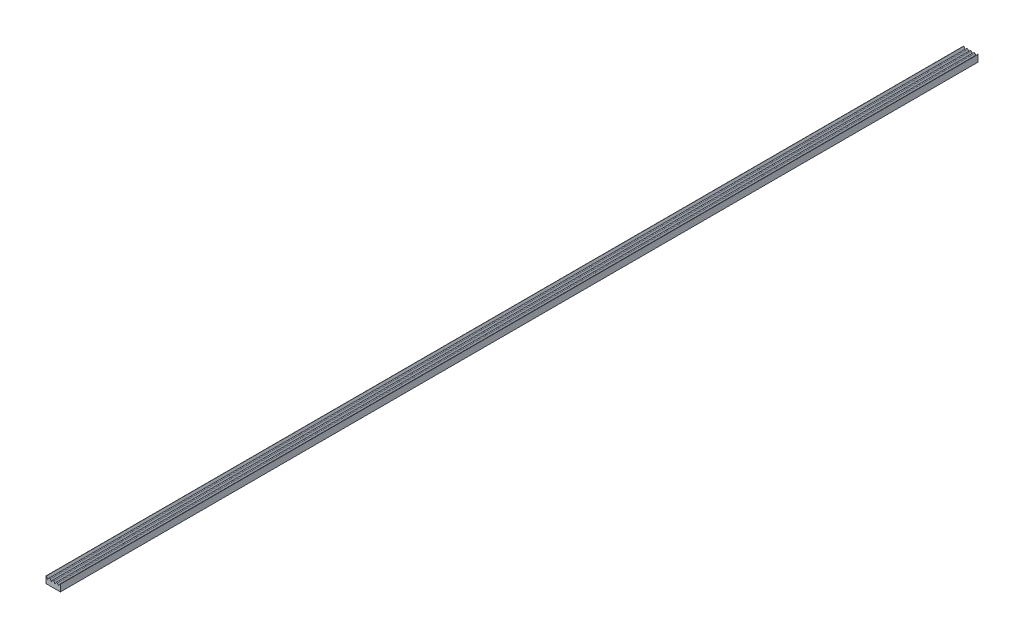
ISO-10303-21;
HEADER;
FILE_DESCRIPTION(('STEP AP214'),'2;1');
FILE_NAME('part.step','',(''),(''),'','','');
FILE_SCHEMA(('AUTOMOTIVE_DESIGN { 1 0 10303 214 1 1 1 1 }'));
ENDSEC;
DATA;
#1=APPLICATION_CONTEXT('core data for automotive mechanical design processes');
#2=APPLICATION_PROTOCOL_DEFINITION('international standard','automotive_design',2000,#1);
#3=PRODUCT_CONTEXT('',#1,'mechanical');
#4=PRODUCT('Part','Part','',(#3));
#5=PRODUCT_RELATED_PRODUCT_CATEGORY('part','',(#4));
#6=PRODUCT_DEFINITION_FORMATION('','',#4);
#7=PRODUCT_DEFINITION_CONTEXT('part definition',#1,'design');
#8=PRODUCT_DEFINITION('design','',#6,#7);
#9=PRODUCT_DEFINITION_SHAPE('','',#8);
#10=(LENGTH_UNIT() NAMED_UNIT(*) SI_UNIT(.MILLI.,.METRE.));
#11=(NAMED_UNIT(*) PLANE_ANGLE_UNIT() SI_UNIT($,.RADIAN.));
#12=(NAMED_UNIT(*) SI_UNIT($,.STERADIAN.) SOLID_ANGLE_UNIT());
#13=UNCERTAINTY_MEASURE_WITH_UNIT(LENGTH_MEASURE(1.E-05),#10,'distance_accuracy_value','');
#14=(GEOMETRIC_REPRESENTATION_CONTEXT(3) GLOBAL_UNCERTAINTY_ASSIGNED_CONTEXT((#13)) GLOBAL_UNIT_ASSIGNED_CONTEXT((#10,
#11,#12)) REPRESENTATION_CONTEXT('',''));
#15=CARTESIAN_POINT('',(0.,0.,0.));
#16=DIRECTION('',(0.,0.,1.));
#17=DIRECTION('',(1.,0.,0.));
#18=AXIS2_PLACEMENT_3D('',#15,#16,#17);
#19=CARTESIAN_POINT('',(0.,0.,809.625));
#20=DIRECTION('',(-1.,0.,0.));
#21=DIRECTION('',(0.,0.,1.));
#22=AXIS2_PLACEMENT_3D('',#19,#20,#21);
#23=PLANE('',#22);
#24=DIRECTION('',(0.,1.,0.));
#25=VECTOR('',#24,1.);
#26=CARTESIAN_POINT('',(0.,0.,0.));
#27=LINE('',#26,#25);
#28=CARTESIAN_POINT('',(0.,0.,0.));
#29=VERTEX_POINT('',#28);
#30=CARTESIAN_POINT('',(0.,5.90717687924576,0.));
#31=VERTEX_POINT('',#30);
#32=EDGE_CURVE('E177',#29,#31,#27,.T.);
#33=ORIENTED_EDGE('',*,*,#32,.T.);
#34=DIRECTION('',(0.,0.,-1.));
#35=VECTOR('',#34,1.);
#36=CARTESIAN_POINT('',(0.,5.90717687924576,809.625));
#37=LINE('',#36,#35);
#38=CARTESIAN_POINT('',(0.,5.90717687924576,809.625));
#39=VERTEX_POINT('',#38);
#40=EDGE_CURVE('E11',#39,#31,#37,.T.);
#41=ORIENTED_EDGE('',*,*,#40,.F.);
#42=DIRECTION('',(0.,1.,0.));
#43=VECTOR('',#42,1.);
#44=CARTESIAN_POINT('',(0.,0.,809.625));
#45=LINE('',#44,#43);
#46=CARTESIAN_POINT('',(0.,0.,809.625));
#47=VERTEX_POINT('',#46);
#48=EDGE_CURVE('E207',#47,#39,#45,.T.);
#49=ORIENTED_EDGE('',*,*,#48,.F.);
#50=DIRECTION('',(0.,0.,-1.));
#51=VECTOR('',#50,1.);
#52=CARTESIAN_POINT('',(0.,0.,809.625));
#53=LINE('',#52,#51);
#54=EDGE_CURVE('E173',#47,#29,#53,.T.);
#55=ORIENTED_EDGE('',*,*,#54,.T.);
#56=EDGE_LOOP('',(#33,#41,#49,#55));
#57=FACE_BOUND('',#56,.T.);
#58=ADVANCED_FACE('F33',(#57),#23,.F.);
#59=CARTESIAN_POINT('',(-0.127,5.90717687924576,809.625));
#60=DIRECTION('',(0.,0.,-1.));
#61=DIRECTION('',(-1.,0.,0.));
#62=AXIS2_PLACEMENT_3D('',#59,#60,#61);
#63=CYLINDRICAL_SURFACE('',#62,0.127);
#64=CARTESIAN_POINT('',(-0.127,5.90717687924576,0.));
#65=DIRECTION('',(0.,0.,1.));
#66=DIRECTION('',(1.,0.,0.));
#67=AXIS2_PLACEMENT_3D('',#64,#65,#66);
#68=CIRCLE('',#67,0.127);
#69=CARTESIAN_POINT('',(-0.234695784608649,5.97448674462616,0.));
#70=VERTEX_POINT('',#69);
#71=EDGE_CURVE('E180',#31,#70,#68,.T.);
#72=ORIENTED_EDGE('',*,*,#71,.T.);
#73=DIRECTION('',(0.,0.,-1.));
#74=VECTOR('',#73,1.);
#75=CARTESIAN_POINT('',(-0.234695784608649,5.97448674462616,809.625));
#76=LINE('',#75,#74);
#77=CARTESIAN_POINT('',(-0.234695784608649,5.97448674462616,809.625));
#78=VERTEX_POINT('',#77);
#79=EDGE_CURVE('E41',#78,#70,#76,.T.);
#80=ORIENTED_EDGE('',*,*,#79,.F.);
#81=CARTESIAN_POINT('',(-0.127,5.90717687924576,809.625));
#82=DIRECTION('',(0.,0.,1.));
#83=DIRECTION('',(1.,0.,0.));
#84=AXIS2_PLACEMENT_3D('',#81,#82,#83);
#85=CIRCLE('',#84,0.127);
#86=EDGE_CURVE('E116',#39,#78,#85,.T.);
#87=ORIENTED_EDGE('',*,*,#86,.F.);
#88=ORIENTED_EDGE('',*,*,#40,.T.);
#89=EDGE_LOOP('',(#72,#80,#87,#88));
#90=FACE_BOUND('',#89,.T.);
#91=ADVANCED_FACE('F305',(#90),#63,.T.);
#92=CARTESIAN_POINT('',(-1.5875,3.81,809.625));
#93=DIRECTION('',(0.847998304005088,-0.529998940003179,0.));
#94=DIRECTION('',(0.529998940003179,0.847998304005088,0.));
#95=AXIS2_PLACEMENT_3D('',#92,#93,#94);
#96=PLANE('',#95);
#97=DIRECTION('',(-0.529998940003179,-0.847998304005088,0.));
#98=VECTOR('',#97,1.);
#99=CARTESIAN_POINT('',(-1.5875,3.81,0.));
#100=LINE('',#99,#98);
#101=CARTESIAN_POINT('',(-1.5875,3.81,0.));
#102=VERTEX_POINT('',#101);
#103=EDGE_CURVE('E182',#70,#102,#100,.T.);
#104=ORIENTED_EDGE('',*,*,#103,.T.);
#105=DIRECTION('',(0.,0.,-1.));
#106=VECTOR('',#105,1.);
#107=CARTESIAN_POINT('',(-1.5875,3.81,809.625));
#108=LINE('',#107,#106);
#109=CARTESIAN_POINT('',(-1.5875,3.81,809.625));
#110=VERTEX_POINT('',#109);
#111=EDGE_CURVE('E238',#110,#102,#108,.T.);
#112=ORIENTED_EDGE('',*,*,#111,.F.);
#113=DIRECTION('',(-0.529998940003179,-0.847998304005088,0.));
#114=VECTOR('',#113,1.);
#115=CARTESIAN_POINT('',(-1.5875,3.81,809.625));
#116=LINE('',#115,#114);
#117=EDGE_CURVE('E246',#78,#110,#116,.T.);
#118=ORIENTED_EDGE('',*,*,#117,.F.);
#119=ORIENTED_EDGE('',*,*,#79,.T.);
#120=EDGE_LOOP('',(#104,#112,#118,#119));
#121=FACE_BOUND('',#120,.T.);
#122=ADVANCED_FACE('F244',(#121),#96,.F.);
#123=CARTESIAN_POINT('',(-2.63652107695677,5.48843372313082,809.625));
#124=DIRECTION('',(-0.847998304005088,-0.52999894000318,0.));
#125=DIRECTION('',(0.52999894000318,-0.847998304005088,0.));
#126=AXIS2_PLACEMENT_3D('',#123,#124,#125);
#127=PLANE('',#126);
#128=DIRECTION('',(-0.52999894000318,0.847998304005088,0.));
#129=VECTOR('',#128,1.);
#130=CARTESIAN_POINT('',(-2.63652107695677,5.48843372313082,0.));
#131=LINE('',#130,#129);
#132=CARTESIAN_POINT('',(-2.63652107695677,5.48843372313082,0.));
#133=VERTEX_POINT('',#132);
#134=EDGE_CURVE('E184',#102,#133,#131,.T.);
#135=ORIENTED_EDGE('',*,*,#134,.T.);
#136=DIRECTION('',(0.,0.,-1.));
#137=VECTOR('',#136,1.);
#138=CARTESIAN_POINT('',(-2.63652107695677,5.48843372313082,809.625));
#139=LINE('',#138,#137);
#140=CARTESIAN_POINT('',(-2.63652107695677,5.48843372313082,809.625));
#141=VERTEX_POINT('',#140);
#142=EDGE_CURVE('E235',#141,#133,#139,.T.);
#143=ORIENTED_EDGE('',*,*,#142,.F.);
#144=DIRECTION('',(-0.52999894000318,0.847998304005088,0.));
#145=VECTOR('',#144,1.);
#146=CARTESIAN_POINT('',(-2.63652107695677,5.48843372313082,809.625));
#147=LINE('',#146,#145);
#148=EDGE_CURVE('E264',#110,#141,#147,.T.);
#149=ORIENTED_EDGE('',*,*,#148,.F.);
#150=ORIENTED_EDGE('',*,*,#111,.T.);
#151=EDGE_LOOP('',(#135,#143,#149,#150));
#152=FACE_BOUND('',#151,.T.);
#153=ADVANCED_FACE('F255',(#152),#127,.F.);
#154=CARTESIAN_POINT('',(-3.175,5.15188439622881,809.625));
#155=DIRECTION('',(0.,0.,-1.));
#156=DIRECTION('',(-1.,0.,0.));
#157=AXIS2_PLACEMENT_3D('',#154,#155,#156);
#158=CYLINDRICAL_SURFACE('',#157,0.635);
#159=CARTESIAN_POINT('',(-3.175,5.15188439622881,0.));
#160=DIRECTION('',(0.,0.,1.));
#161=DIRECTION('',(-1.,0.,0.));
#162=AXIS2_PLACEMENT_3D('',#159,#160,#161);
#163=CIRCLE('',#162,0.635);
#164=CARTESIAN_POINT('',(-3.71347892304324,5.48843372313082,0.));
#165=VERTEX_POINT('',#164);
#166=EDGE_CURVE('E186',#133,#165,#163,.T.);
#167=ORIENTED_EDGE('',*,*,#166,.T.);
#168=DIRECTION('',(0.,0.,-1.));
#169=VECTOR('',#168,1.);
#170=CARTESIAN_POINT('',(-3.71347892304324,5.48843372313082,809.625));
#171=LINE('',#170,#169);
#172=CARTESIAN_POINT('',(-3.71347892304324,5.48843372313082,809.625));
#173=VERTEX_POINT('',#172);
#174=EDGE_CURVE('E232',#173,#165,#171,.T.);
#175=ORIENTED_EDGE('',*,*,#174,.F.);
#176=CARTESIAN_POINT('',(-3.175,5.15188439622881,809.625));
#177=DIRECTION('',(0.,0.,1.));
#178=DIRECTION('',(-1.,0.,0.));
#179=AXIS2_PLACEMENT_3D('',#176,#177,#178);
#180=CIRCLE('',#179,0.635);
#181=EDGE_CURVE('E261',#141,#173,#180,.T.);
#182=ORIENTED_EDGE('',*,*,#181,.F.);
#183=ORIENTED_EDGE('',*,*,#142,.T.);
#184=EDGE_LOOP('',(#167,#175,#182,#183));
#185=FACE_BOUND('',#184,.T.);
#186=ADVANCED_FACE('F259',(#185),#158,.T.);
#187=CARTESIAN_POINT('',(-4.7625,3.81,809.625));
#188=DIRECTION('',(0.847998304005088,-0.52999894000318,0.));
#189=DIRECTION('',(0.52999894000318,0.847998304005088,0.));
#190=AXIS2_PLACEMENT_3D('',#187,#188,#189);
#191=PLANE('',#190);
#192=DIRECTION('',(-0.52999894000318,-0.847998304005088,0.));
#193=VECTOR('',#192,1.);
#194=CARTESIAN_POINT('',(-4.7625,3.81,0.));
#195=LINE('',#194,#193);
#196=CARTESIAN_POINT('',(-4.7625,3.81,0.));
#197=VERTEX_POINT('',#196);
#198=EDGE_CURVE('E188',#165,#197,#195,.T.);
#199=ORIENTED_EDGE('',*,*,#198,.T.);
#200=DIRECTION('',(0.,0.,-1.));
#201=VECTOR('',#200,1.);
#202=CARTESIAN_POINT('',(-4.7625,3.81,809.625));
#203=LINE('',#202,#201);
#204=CARTESIAN_POINT('',(-4.7625,3.81,809.625));
#205=VERTEX_POINT('',#204);
#206=EDGE_CURVE('E229',#205,#197,#203,.T.);
#207=ORIENTED_EDGE('',*,*,#206,.F.);
#208=DIRECTION('',(-0.52999894000318,-0.847998304005088,0.));
#209=VECTOR('',#208,1.);
#210=CARTESIAN_POINT('',(-4.7625,3.81,809.625));
#211=LINE('',#210,#209);
#212=EDGE_CURVE('E263',#173,#205,#211,.T.);
#213=ORIENTED_EDGE('',*,*,#212,.F.);
#214=ORIENTED_EDGE('',*,*,#174,.T.);
#215=EDGE_LOOP('',(#199,#207,#213,#214));
#216=FACE_BOUND('',#215,.T.);
#217=ADVANCED_FACE('F318',(#216),#191,.F.);
#218=CARTESIAN_POINT('',(-4.7625,3.81,809.625));
#219=DIRECTION('',(-0.847998304005088,-0.52999894000318,0.));
#220=DIRECTION('',(0.52999894000318,-0.847998304005088,0.));
#221=AXIS2_PLACEMENT_3D('',#218,#219,#220);
#222=PLANE('',#221);
#223=DIRECTION('',(-0.52999894000318,0.847998304005088,0.));
#224=VECTOR('',#223,1.);
#225=CARTESIAN_POINT('',(-4.7625,3.81,0.));
#226=LINE('',#225,#224);
#227=CARTESIAN_POINT('',(-5.81152107695676,5.48843372313082,0.));
#228=VERTEX_POINT('',#227);
#229=EDGE_CURVE('E190',#197,#228,#226,.T.);
#230=ORIENTED_EDGE('',*,*,#229,.T.);
#231=DIRECTION('',(0.,0.,-1.));
#232=VECTOR('',#231,1.);
#233=CARTESIAN_POINT('',(-5.81152107695676,5.48843372313082,809.625));
#234=LINE('',#233,#232);
#235=CARTESIAN_POINT('',(-5.81152107695676,5.48843372313082,809.625));
#236=VERTEX_POINT('',#235);
#237=EDGE_CURVE('E226',#236,#228,#234,.T.);
#238=ORIENTED_EDGE('',*,*,#237,.F.);
#239=DIRECTION('',(-0.52999894000318,0.847998304005088,0.));
#240=VECTOR('',#239,1.);
#241=CARTESIAN_POINT('',(-4.7625,3.81,809.625));
#242=LINE('',#241,#240);
#243=EDGE_CURVE('E266',#205,#236,#242,.T.);
#244=ORIENTED_EDGE('',*,*,#243,.F.);
#245=ORIENTED_EDGE('',*,*,#206,.T.);
#246=EDGE_LOOP('',(#230,#238,#244,#245));
#247=FACE_BOUND('',#246,.T.);
#248=ADVANCED_FACE('F321',(#247),#222,.F.);
#249=CARTESIAN_POINT('',(-6.35,5.15188439622881,809.625));
#250=DIRECTION('',(0.,0.,-1.));
#251=DIRECTION('',(-1.,0.,0.));
#252=AXIS2_PLACEMENT_3D('',#249,#250,#251);
#253=CYLINDRICAL_SURFACE('',#252,0.635);
#254=CARTESIAN_POINT('',(-6.35,5.15188439622881,0.));
#255=DIRECTION('',(0.,0.,1.));
#256=DIRECTION('',(-1.,0.,0.));
#257=AXIS2_PLACEMENT_3D('',#254,#255,#256);
#258=CIRCLE('',#257,0.635);
#259=CARTESIAN_POINT('',(-6.88847892304323,5.48843372313082,0.));
#260=VERTEX_POINT('',#259);
#261=EDGE_CURVE('E192',#228,#260,#258,.T.);
#262=ORIENTED_EDGE('',*,*,#261,.T.);
#263=DIRECTION('',(0.,0.,-1.));
#264=VECTOR('',#263,1.);
#265=CARTESIAN_POINT('',(-6.88847892304323,5.48843372313082,809.625));
#266=LINE('',#265,#264);
#267=CARTESIAN_POINT('',(-6.88847892304323,5.48843372313082,809.625));
#268=VERTEX_POINT('',#267);
#269=EDGE_CURVE('E223',#268,#260,#266,.T.);
#270=ORIENTED_EDGE('',*,*,#269,.F.);
#271=CARTESIAN_POINT('',(-6.35,5.15188439622881,809.625));
#272=DIRECTION('',(0.,0.,1.));
#273=DIRECTION('',(-1.,0.,0.));
#274=AXIS2_PLACEMENT_3D('',#271,#272,#273);
#275=CIRCLE('',#274,0.635);
#276=EDGE_CURVE('E272',#236,#268,#275,.T.);
#277=ORIENTED_EDGE('',*,*,#276,.F.);
#278=ORIENTED_EDGE('',*,*,#237,.T.);
#279=EDGE_LOOP('',(#262,#270,#277,#278));
#280=FACE_BOUND('',#279,.T.);
#281=ADVANCED_FACE('F325',(#280),#253,.T.);
#282=CARTESIAN_POINT('',(-7.9375,3.81,809.625));
#283=DIRECTION('',(0.847998304005088,-0.52999894000318,0.));
#284=DIRECTION('',(0.52999894000318,0.847998304005088,0.));
#285=AXIS2_PLACEMENT_3D('',#282,#283,#284);
#286=PLANE('',#285);
#287=DIRECTION('',(-0.52999894000318,-0.847998304005088,0.));
#288=VECTOR('',#287,1.);
#289=CARTESIAN_POINT('',(-7.9375,3.81,0.));
#290=LINE('',#289,#288);
#291=CARTESIAN_POINT('',(-7.9375,3.81,0.));
#292=VERTEX_POINT('',#291);
#293=EDGE_CURVE('E194',#260,#292,#290,.T.);
#294=ORIENTED_EDGE('',*,*,#293,.T.);
#295=DIRECTION('',(0.,0.,-1.));
#296=VECTOR('',#295,1.);
#297=CARTESIAN_POINT('',(-7.9375,3.81,809.625));
#298=LINE('',#297,#296);
#299=CARTESIAN_POINT('',(-7.9375,3.81,809.625));
#300=VERTEX_POINT('',#299);
#301=EDGE_CURVE('E220',#300,#292,#298,.T.);
#302=ORIENTED_EDGE('',*,*,#301,.F.);
#303=DIRECTION('',(-0.52999894000318,-0.847998304005088,0.));
#304=VECTOR('',#303,1.);
#305=CARTESIAN_POINT('',(-7.9375,3.81,809.625));
#306=LINE('',#305,#304);
#307=EDGE_CURVE('E274',#268,#300,#306,.T.);
#308=ORIENTED_EDGE('',*,*,#307,.F.);
#309=ORIENTED_EDGE('',*,*,#269,.T.);
#310=EDGE_LOOP('',(#294,#302,#308,#309));
#311=FACE_BOUND('',#310,.T.);
#312=ADVANCED_FACE('F329',(#311),#286,.F.);
#313=CARTESIAN_POINT('',(-7.9375,3.81,809.625));
#314=DIRECTION('',(-0.847998304005088,-0.52999894000318,0.));
#315=DIRECTION('',(0.52999894000318,-0.847998304005088,0.));
#316=AXIS2_PLACEMENT_3D('',#313,#314,#315);
#317=PLANE('',#316);
#318=DIRECTION('',(-0.52999894000318,0.847998304005088,0.));
#319=VECTOR('',#318,1.);
#320=CARTESIAN_POINT('',(-7.9375,3.81,0.));
#321=LINE('',#320,#319);
#322=CARTESIAN_POINT('',(-8.98652107695676,5.48843372313082,0.));
#323=VERTEX_POINT('',#322);
#324=EDGE_CURVE('E196',#292,#323,#321,.T.);
#325=ORIENTED_EDGE('',*,*,#324,.T.);
#326=DIRECTION('',(0.,0.,-1.));
#327=VECTOR('',#326,1.);
#328=CARTESIAN_POINT('',(-8.98652107695676,5.48843372313082,809.625));
#329=LINE('',#328,#327);
#330=CARTESIAN_POINT('',(-8.98652107695676,5.48843372313082,809.625));
#331=VERTEX_POINT('',#330);
#332=EDGE_CURVE('E217',#331,#323,#329,.T.);
#333=ORIENTED_EDGE('',*,*,#332,.F.);
#334=DIRECTION('',(-0.52999894000318,0.847998304005088,0.));
#335=VECTOR('',#334,1.);
#336=CARTESIAN_POINT('',(-7.9375,3.81,809.625));
#337=LINE('',#336,#335);
#338=EDGE_CURVE('E276',#300,#331,#337,.T.);
#339=ORIENTED_EDGE('',*,*,#338,.F.);
#340=ORIENTED_EDGE('',*,*,#301,.T.);
#341=EDGE_LOOP('',(#325,#333,#339,#340));
#342=FACE_BOUND('',#341,.T.);
#343=ADVANCED_FACE('F333',(#342),#317,.F.);
#344=CARTESIAN_POINT('',(-9.525,5.15188439622881,809.625));
#345=DIRECTION('',(0.,0.,-1.));
#346=DIRECTION('',(-1.,0.,0.));
#347=AXIS2_PLACEMENT_3D('',#344,#345,#346);
#348=CYLINDRICAL_SURFACE('',#347,0.635);
#349=CARTESIAN_POINT('',(-9.525,5.15188439622881,0.));
#350=DIRECTION('',(0.,0.,1.));
#351=DIRECTION('',(1.,0.,0.));
#352=AXIS2_PLACEMENT_3D('',#349,#350,#351);
#353=CIRCLE('',#352,0.635);
#354=CARTESIAN_POINT('',(-10.0634789230432,5.48843372313082,0.));
#355=VERTEX_POINT('',#354);
#356=EDGE_CURVE('E198',#323,#355,#353,.T.);
#357=ORIENTED_EDGE('',*,*,#356,.T.);
#358=DIRECTION('',(0.,0.,-1.));
#359=VECTOR('',#358,1.);
#360=CARTESIAN_POINT('',(-10.0634789230432,5.48843372313082,809.625));
#361=LINE('',#360,#359);
#362=CARTESIAN_POINT('',(-10.0634789230432,5.48843372313082,809.625));
#363=VERTEX_POINT('',#362);
#364=EDGE_CURVE('E214',#363,#355,#361,.T.);
#365=ORIENTED_EDGE('',*,*,#364,.F.);
#366=CARTESIAN_POINT('',(-9.525,5.15188439622881,809.625));
#367=DIRECTION('',(0.,0.,1.));
#368=DIRECTION('',(1.,0.,0.));
#369=AXIS2_PLACEMENT_3D('',#366,#367,#368);
#370=CIRCLE('',#369,0.635);
#371=EDGE_CURVE('E278',#331,#363,#370,.T.);
#372=ORIENTED_EDGE('',*,*,#371,.F.);
#373=ORIENTED_EDGE('',*,*,#332,.T.);
#374=EDGE_LOOP('',(#357,#365,#372,#373));
#375=FACE_BOUND('',#374,.T.);
#376=ADVANCED_FACE('F337',(#375),#348,.T.);
#377=CARTESIAN_POINT('',(-10.0634789230432,5.48843372313082,809.625));
#378=DIRECTION('',(0.847998304005088,-0.52999894000318,0.));
#379=DIRECTION('',(0.52999894000318,0.847998304005088,0.));
#380=AXIS2_PLACEMENT_3D('',#377,#378,#379);
#381=PLANE('',#380);
#382=DIRECTION('',(-0.52999894000318,-0.847998304005088,0.));
#383=VECTOR('',#382,1.);
#384=CARTESIAN_POINT('',(-10.0634789230432,5.48843372313082,0.));
#385=LINE('',#384,#383);
#386=CARTESIAN_POINT('',(-11.1125,3.81,0.));
#387=VERTEX_POINT('',#386);
#388=EDGE_CURVE('E200',#355,#387,#385,.T.);
#389=ORIENTED_EDGE('',*,*,#388,.T.);
#390=DIRECTION('',(0.,0.,-1.));
#391=VECTOR('',#390,1.);
#392=CARTESIAN_POINT('',(-11.1125,3.81,809.625));
#393=LINE('',#392,#391);
#394=CARTESIAN_POINT('',(-11.1125,3.81,809.625));
#395=VERTEX_POINT('',#394);
#396=EDGE_CURVE('E211',#395,#387,#393,.T.);
#397=ORIENTED_EDGE('',*,*,#396,.F.);
#398=DIRECTION('',(-0.52999894000318,-0.847998304005088,0.));
#399=VECTOR('',#398,1.);
#400=CARTESIAN_POINT('',(-10.0634789230432,5.48843372313082,809.625));
#401=LINE('',#400,#399);
#402=EDGE_CURVE('E280',#363,#395,#401,.T.);
#403=ORIENTED_EDGE('',*,*,#402,.F.);
#404=ORIENTED_EDGE('',*,*,#364,.T.);
#405=EDGE_LOOP('',(#389,#397,#403,#404));
#406=FACE_BOUND('',#405,.T.);
#407=ADVANCED_FACE('F286',(#406),#381,.F.);
#408=CARTESIAN_POINT('',(-11.1125,3.81,809.625));
#409=DIRECTION('',(-0.847998304005088,-0.52999894000318,0.));
#410=DIRECTION('',(0.52999894000318,-0.847998304005088,0.));
#411=AXIS2_PLACEMENT_3D('',#408,#409,#410);
#412=PLANE('',#411);
#413=DIRECTION('',(-0.52999894000318,0.847998304005088,0.));
#414=VECTOR('',#413,1.);
#415=CARTESIAN_POINT('',(-11.1125,3.81,0.));
#416=LINE('',#415,#414);
#417=CARTESIAN_POINT('',(-12.4653042153914,5.97448674462616,0.));
#418=VERTEX_POINT('',#417);
#419=EDGE_CURVE('E202',#387,#418,#416,.T.);
#420=ORIENTED_EDGE('',*,*,#419,.T.);
#421=DIRECTION('',(0.,0.,-1.));
#422=VECTOR('',#421,1.);
#423=CARTESIAN_POINT('',(-12.4653042153914,5.97448674462616,809.625));
#424=LINE('',#423,#422);
#425=CARTESIAN_POINT('',(-12.4653042153914,5.97448674462616,809.625));
#426=VERTEX_POINT('',#425);
#427=EDGE_CURVE('E168',#426,#418,#424,.T.);
#428=ORIENTED_EDGE('',*,*,#427,.F.);
#429=DIRECTION('',(-0.52999894000318,0.847998304005088,0.));
#430=VECTOR('',#429,1.);
#431=CARTESIAN_POINT('',(-11.1125,3.81,809.625));
#432=LINE('',#431,#430);
#433=EDGE_CURVE('E159',#395,#426,#432,.T.);
#434=ORIENTED_EDGE('',*,*,#433,.F.);
#435=ORIENTED_EDGE('',*,*,#396,.T.);
#436=EDGE_LOOP('',(#420,#428,#434,#435));
#437=FACE_BOUND('',#436,.T.);
#438=ADVANCED_FACE('F290',(#437),#412,.F.);
#439=CARTESIAN_POINT('',(-12.573,5.90717687924576,809.625));
#440=DIRECTION('',(0.,0.,-1.));
#441=DIRECTION('',(-1.,0.,0.));
#442=AXIS2_PLACEMENT_3D('',#439,#440,#441);
#443=CYLINDRICAL_SURFACE('',#442,0.127);
#444=CARTESIAN_POINT('',(-12.573,5.90717687924576,0.));
#445=DIRECTION('',(0.,0.,1.));
#446=DIRECTION('',(1.,0.,0.));
#447=AXIS2_PLACEMENT_3D('',#444,#445,#446);
#448=CIRCLE('',#447,0.127);
#449=CARTESIAN_POINT('',(-12.7,5.90717687924575,0.));
#450=VERTEX_POINT('',#449);
#451=EDGE_CURVE('E167',#418,#450,#448,.T.);
#452=ORIENTED_EDGE('',*,*,#451,.T.);
#453=DIRECTION('',(0.,0.,-1.));
#454=VECTOR('',#453,1.);
#455=CARTESIAN_POINT('',(-12.7,5.90717687924575,809.625));
#456=LINE('',#455,#454);
#457=CARTESIAN_POINT('',(-12.7,5.90717687924575,809.625));
#458=VERTEX_POINT('',#457);
#459=EDGE_CURVE('E164',#458,#450,#456,.T.);
#460=ORIENTED_EDGE('',*,*,#459,.F.);
#461=CARTESIAN_POINT('',(-12.573,5.90717687924576,809.625));
#462=DIRECTION('',(0.,0.,1.));
#463=DIRECTION('',(1.,0.,0.));
#464=AXIS2_PLACEMENT_3D('',#461,#462,#463);
#465=CIRCLE('',#464,0.127);
#466=EDGE_CURVE('E153',#426,#458,#465,.T.);
#467=ORIENTED_EDGE('',*,*,#466,.F.);
#468=ORIENTED_EDGE('',*,*,#427,.T.);
#469=EDGE_LOOP('',(#452,#460,#467,#468));
#470=FACE_BOUND('',#469,.T.);
#471=ADVANCED_FACE('F165',(#470),#443,.T.);
#472=CARTESIAN_POINT('',(-12.7,0.,809.625));
#473=DIRECTION('',(1.,0.,0.));
#474=DIRECTION('',(0.,0.,-1.));
#475=AXIS2_PLACEMENT_3D('',#472,#473,#474);
#476=PLANE('',#475);
#477=DIRECTION('',(0.,-1.,0.));
#478=VECTOR('',#477,1.);
#479=CARTESIAN_POINT('',(-12.7,0.,0.));
#480=LINE('',#479,#478);
#481=CARTESIAN_POINT('',(-12.7,0.,0.));
#482=VERTEX_POINT('',#481);
#483=EDGE_CURVE('E102',#450,#482,#480,.T.);
#484=ORIENTED_EDGE('',*,*,#483,.T.);
#485=DIRECTION('',(0.,0.,-1.));
#486=VECTOR('',#485,1.);
#487=CARTESIAN_POINT('',(-12.7,0.,809.625));
#488=LINE('',#487,#486);
#489=CARTESIAN_POINT('',(-12.7,0.,809.625));
#490=VERTEX_POINT('',#489);
#491=EDGE_CURVE('E169',#490,#482,#488,.T.);
#492=ORIENTED_EDGE('',*,*,#491,.F.);
#493=DIRECTION('',(0.,-1.,0.));
#494=VECTOR('',#493,1.);
#495=CARTESIAN_POINT('',(-12.7,0.,809.625));
#496=LINE('',#495,#494);
#497=EDGE_CURVE('E157',#458,#490,#496,.T.);
#498=ORIENTED_EDGE('',*,*,#497,.F.);
#499=ORIENTED_EDGE('',*,*,#459,.T.);
#500=EDGE_LOOP('',(#484,#492,#498,#499));
#501=FACE_BOUND('',#500,.T.);
#502=ADVANCED_FACE('F171',(#501),#476,.F.);
#503=CARTESIAN_POINT('',(0.,0.,809.625));
#504=DIRECTION('',(0.,1.,0.));
#505=DIRECTION('',(-1.,0.,0.));
#506=AXIS2_PLACEMENT_3D('',#503,#504,#505);
#507=PLANE('',#506);
#508=DIRECTION('',(1.,0.,0.));
#509=VECTOR('',#508,1.);
#510=CARTESIAN_POINT('',(0.,0.,0.));
#511=LINE('',#510,#509);
#512=EDGE_CURVE('E108',#482,#29,#511,.T.);
#513=ORIENTED_EDGE('',*,*,#512,.T.);
#514=ORIENTED_EDGE('',*,*,#54,.F.);
#515=DIRECTION('',(1.,0.,0.));
#516=VECTOR('',#515,1.);
#517=CARTESIAN_POINT('',(0.,0.,809.625));
#518=LINE('',#517,#516);
#519=EDGE_CURVE('E49',#490,#47,#518,.T.);
#520=ORIENTED_EDGE('',*,*,#519,.F.);
#521=ORIENTED_EDGE('',*,*,#491,.T.);
#522=EDGE_LOOP('',(#513,#514,#520,#521));
#523=FACE_BOUND('',#522,.T.);
#524=ADVANCED_FACE('F294',(#523),#507,.F.);
#525=CARTESIAN_POINT('',(-0.127,5.90717687924576,809.625));
#526=DIRECTION('',(0.,0.,1.));
#527=DIRECTION('',(1.,0.,0.));
#528=AXIS2_PLACEMENT_3D('',#525,#526,#527);
#529=PLANE('',#528);
#530=ORIENTED_EDGE('',*,*,#48,.T.);
#531=ORIENTED_EDGE('',*,*,#86,.T.);
#532=ORIENTED_EDGE('',*,*,#117,.T.);
#533=ORIENTED_EDGE('',*,*,#148,.T.);
#534=ORIENTED_EDGE('',*,*,#181,.T.);
#535=ORIENTED_EDGE('',*,*,#212,.T.);
#536=ORIENTED_EDGE('',*,*,#243,.T.);
#537=ORIENTED_EDGE('',*,*,#276,.T.);
#538=ORIENTED_EDGE('',*,*,#307,.T.);
#539=ORIENTED_EDGE('',*,*,#338,.T.);
#540=ORIENTED_EDGE('',*,*,#371,.T.);
#541=ORIENTED_EDGE('',*,*,#402,.T.);
#542=ORIENTED_EDGE('',*,*,#433,.T.);
#543=ORIENTED_EDGE('',*,*,#466,.T.);
#544=ORIENTED_EDGE('',*,*,#497,.T.);
#545=ORIENTED_EDGE('',*,*,#519,.T.);
#546=EDGE_LOOP('',(#530,#531,#532,#533,#534,#535,#536,#537,#538,#539,#540,#541,#542,#543,#544,#545));
#547=FACE_BOUND('',#546,.T.);
#548=ADVANCED_FACE('F155',(#547),#529,.T.);
#549=CARTESIAN_POINT('',(-0.127,5.90717687924576,0.));
#550=DIRECTION('',(0.,0.,1.));
#551=DIRECTION('',(1.,0.,0.));
#552=AXIS2_PLACEMENT_3D('',#549,#550,#551);
#553=PLANE('',#552);
#554=ORIENTED_EDGE('',*,*,#32,.F.);
#555=ORIENTED_EDGE('',*,*,#512,.F.);
#556=ORIENTED_EDGE('',*,*,#483,.F.);
#557=ORIENTED_EDGE('',*,*,#451,.F.);
#558=ORIENTED_EDGE('',*,*,#419,.F.);
#559=ORIENTED_EDGE('',*,*,#388,.F.);
#560=ORIENTED_EDGE('',*,*,#356,.F.);
#561=ORIENTED_EDGE('',*,*,#324,.F.);
#562=ORIENTED_EDGE('',*,*,#293,.F.);
#563=ORIENTED_EDGE('',*,*,#261,.F.);
#564=ORIENTED_EDGE('',*,*,#229,.F.);
#565=ORIENTED_EDGE('',*,*,#198,.F.);
#566=ORIENTED_EDGE('',*,*,#166,.F.);
#567=ORIENTED_EDGE('',*,*,#134,.F.);
#568=ORIENTED_EDGE('',*,*,#103,.F.);
#569=ORIENTED_EDGE('',*,*,#71,.F.);
#570=EDGE_LOOP('',(#554,#555,#556,#557,#558,#559,#560,#561,#562,#563,#564,#565,#566,#567,#568,#569));
#571=FACE_BOUND('',#570,.T.);
#572=ADVANCED_FACE('F250',(#571),#553,.F.);
#573=CLOSED_SHELL('',(#58,#91,#122,#153,#186,#217,#248,#281,#312,#343,#376,#407,#438,#471,#502,
#524,#548,#572));
#574=MANIFOLD_SOLID_BREP('B2',#573);
#575=ADVANCED_BREP_SHAPE_REPRESENTATION('',(#18,#574),#14);
#576=SHAPE_DEFINITION_REPRESENTATION(#9,#575);
ENDSEC;
END-ISO-10303-21;
